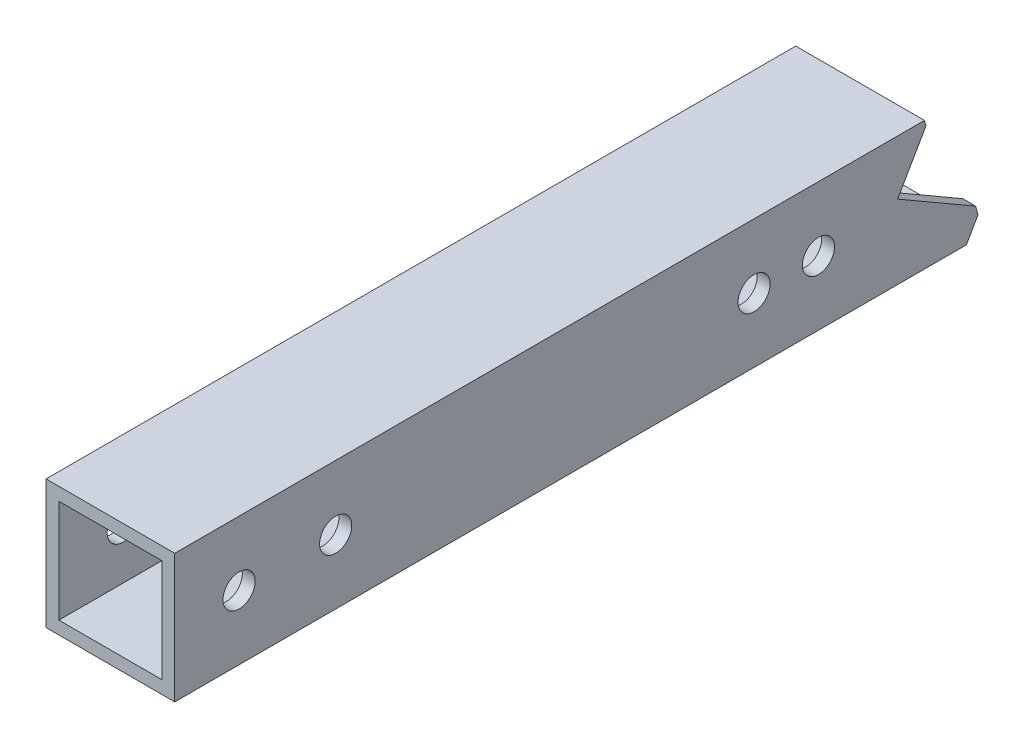
ISO-10303-21;
HEADER;
FILE_DESCRIPTION(('STEP AP214'),'2;1');
FILE_NAME('part.step','',(''),(''),'','','');
FILE_SCHEMA(('AUTOMOTIVE_DESIGN { 1 0 10303 214 1 1 1 1 }'));
ENDSEC;
DATA;
#1=APPLICATION_CONTEXT('core data for automotive mechanical design processes');
#2=APPLICATION_PROTOCOL_DEFINITION('international standard','automotive_design',2000,#1);
#3=PRODUCT_CONTEXT('',#1,'mechanical');
#4=PRODUCT('Part','Part','',(#3));
#5=PRODUCT_RELATED_PRODUCT_CATEGORY('part','',(#4));
#6=PRODUCT_DEFINITION_FORMATION('','',#4);
#7=PRODUCT_DEFINITION_CONTEXT('part definition',#1,'design');
#8=PRODUCT_DEFINITION('design','',#6,#7);
#9=PRODUCT_DEFINITION_SHAPE('','',#8);
#10=(LENGTH_UNIT() NAMED_UNIT(*) SI_UNIT(.MILLI.,.METRE.));
#11=(NAMED_UNIT(*) PLANE_ANGLE_UNIT() SI_UNIT($,.RADIAN.));
#12=(NAMED_UNIT(*) SI_UNIT($,.STERADIAN.) SOLID_ANGLE_UNIT());
#13=UNCERTAINTY_MEASURE_WITH_UNIT(LENGTH_MEASURE(1.E-05),#10,'distance_accuracy_value','');
#14=(GEOMETRIC_REPRESENTATION_CONTEXT(3) GLOBAL_UNCERTAINTY_ASSIGNED_CONTEXT((#13)) GLOBAL_UNIT_ASSIGNED_CONTEXT((#10,
#11,#12)) REPRESENTATION_CONTEXT('',''));
#15=CARTESIAN_POINT('',(0.,0.,0.));
#16=DIRECTION('',(0.,0.,1.));
#17=DIRECTION('',(1.,0.,0.));
#18=AXIS2_PLACEMENT_3D('',#15,#16,#17);
#19=CARTESIAN_POINT('',(10.,1.49899999999999,-12.3));
#20=DIRECTION('',(0.,0.86602540378444,-0.499999999999998));
#21=DIRECTION('',(0.,0.499999999999998,0.86602540378444));
#22=AXIS2_PLACEMENT_3D('',#19,#20,#21);
#23=PLANE('',#22);
#24=DIRECTION('',(0.,0.499999999999998,0.86602540378444));
#25=VECTOR('',#24,1.);
#26=CARTESIAN_POINT('',(-7.99999999999999,1.49899999999999,-12.3));
#27=LINE('',#26,#25);
#28=CARTESIAN_POINT('',(-7.99999999999999,-5.50074999999994,-24.4239226402802));
#29=VERTEX_POINT('',#28);
#30=CARTESIAN_POINT('',(-7.99999999999999,1.499,-12.3));
#31=VERTEX_POINT('',#30);
#32=EDGE_CURVE('E227',#29,#31,#27,.T.);
#33=ORIENTED_EDGE('',*,*,#32,.F.);
#34=DIRECTION('',(-1.,0.,0.));
#35=VECTOR('',#34,1.);
#36=CARTESIAN_POINT('',(-10.,-5.50074999999994,-24.4239226402802));
#37=LINE('',#36,#35);
#38=CARTESIAN_POINT('',(-10.,-5.50074999999994,-24.4239226402802));
#39=VERTEX_POINT('',#38);
#40=EDGE_CURVE('E266',#29,#39,#37,.T.);
#41=ORIENTED_EDGE('',*,*,#40,.T.);
#42=DIRECTION('',(0.,-0.499999999999998,-0.86602540378444));
#43=VECTOR('',#42,1.);
#44=CARTESIAN_POINT('',(-10.,1.49899999999999,-12.3));
#45=LINE('',#44,#43);
#46=CARTESIAN_POINT('',(-10.,1.49899999999999,-12.3));
#47=VERTEX_POINT('',#46);
#48=EDGE_CURVE('E274',#47,#39,#45,.T.);
#49=ORIENTED_EDGE('',*,*,#48,.F.);
#50=DIRECTION('',(-1.,0.,0.));
#51=VECTOR('',#50,1.);
#52=CARTESIAN_POINT('',(10.,1.49899999999999,-12.3));
#53=LINE('',#52,#51);
#54=EDGE_CURVE('E281',#31,#47,#53,.T.);
#55=ORIENTED_EDGE('',*,*,#54,.F.);
#56=EDGE_LOOP('',(#33,#41,#49,#55));
#57=FACE_BOUND('',#56,.T.);
#58=ADVANCED_FACE('F41',(#57),#23,.T.);
#59=CARTESIAN_POINT('',(0.,0.,-12.3));
#60=DIRECTION('',(0.,0.,1.));
#61=DIRECTION('',(1.,0.,0.));
#62=AXIS2_PLACEMENT_3D('',#59,#60,#61);
#63=PLANE('',#62);
#64=DIRECTION('',(0.,-1.,0.));
#65=VECTOR('',#64,1.);
#66=CARTESIAN_POINT('',(10.,-9.99999999999999,-12.3));
#67=LINE('',#66,#65);
#68=CARTESIAN_POINT('',(10.,1.49999999999999,-12.3));
#69=VERTEX_POINT('',#68);
#70=CARTESIAN_POINT('',(10.,1.49899999999999,-12.3));
#71=VERTEX_POINT('',#70);
#72=EDGE_CURVE('E444',#69,#71,#67,.T.);
#73=ORIENTED_EDGE('',*,*,#72,.T.);
#74=CARTESIAN_POINT('',(7.99999999999999,1.499,-12.3));
#75=VERTEX_POINT('',#74);
#76=EDGE_CURVE('E316',#71,#75,#53,.T.);
#77=ORIENTED_EDGE('',*,*,#76,.T.);
#78=DIRECTION('',(0.,-1.,0.));
#79=VECTOR('',#78,1.);
#80=CARTESIAN_POINT('',(8.00000000000002,-8.00000000000001,-12.3));
#81=LINE('',#80,#79);
#82=CARTESIAN_POINT('',(7.99999999999999,1.49999999999999,-12.3));
#83=VERTEX_POINT('',#82);
#84=EDGE_CURVE('E294',#83,#75,#81,.T.);
#85=ORIENTED_EDGE('',*,*,#84,.F.);
#86=DIRECTION('',(-1.,0.,0.));
#87=VECTOR('',#86,1.);
#88=CARTESIAN_POINT('',(10.,1.49999999999999,-12.3));
#89=LINE('',#88,#87);
#90=EDGE_CURVE('E295',#69,#83,#89,.T.);
#91=ORIENTED_EDGE('',*,*,#90,.F.);
#92=EDGE_LOOP('',(#73,#77,#85,#91));
#93=FACE_BOUND('',#92,.T.);
#94=ADVANCED_FACE('F374',(#93),#63,.F.);
#95=DIRECTION('',(0.,1.,0.));
#96=VECTOR('',#95,1.);
#97=CARTESIAN_POINT('',(-8.00000000000002,-8.00000000000001,-12.3));
#98=LINE('',#97,#96);
#99=CARTESIAN_POINT('',(-7.99999999999999,1.49999999999999,-12.3));
#100=VERTEX_POINT('',#99);
#101=EDGE_CURVE('E287',#31,#100,#98,.T.);
#102=ORIENTED_EDGE('',*,*,#101,.F.);
#103=ORIENTED_EDGE('',*,*,#54,.T.);
#104=DIRECTION('',(0.,1.,0.));
#105=VECTOR('',#104,1.);
#106=CARTESIAN_POINT('',(-10.,-9.99999999999999,-12.3));
#107=LINE('',#106,#105);
#108=CARTESIAN_POINT('',(-10.,1.49999999999999,-12.3));
#109=VERTEX_POINT('',#108);
#110=EDGE_CURVE('E300',#47,#109,#107,.T.);
#111=ORIENTED_EDGE('',*,*,#110,.T.);
#112=EDGE_CURVE('E210',#100,#109,#89,.T.);
#113=ORIENTED_EDGE('',*,*,#112,.F.);
#114=EDGE_LOOP('',(#102,#103,#111,#113));
#115=FACE_BOUND('',#114,.T.);
#116=ADVANCED_FACE('F299',(#115),#63,.F.);
#117=CARTESIAN_POINT('',(0.,0.,100.));
#118=DIRECTION('',(0.,0.,1.));
#119=DIRECTION('',(1.,0.,0.));
#120=AXIS2_PLACEMENT_3D('',#117,#118,#119);
#121=PLANE('',#120);
#122=DIRECTION('',(0.,1.,0.));
#123=VECTOR('',#122,1.);
#124=CARTESIAN_POINT('',(10.,9.99999999999999,100.));
#125=LINE('',#124,#123);
#126=CARTESIAN_POINT('',(10.,-10.,100.));
#127=VERTEX_POINT('',#126);
#128=CARTESIAN_POINT('',(10.,9.99999999999999,100.));
#129=VERTEX_POINT('',#128);
#130=EDGE_CURVE('E191',#127,#129,#125,.T.);
#131=ORIENTED_EDGE('',*,*,#130,.T.);
#132=DIRECTION('',(-1.,0.,0.));
#133=VECTOR('',#132,1.);
#134=CARTESIAN_POINT('',(-10.,9.99999999999999,100.));
#135=LINE('',#134,#133);
#136=CARTESIAN_POINT('',(-10.,9.99999999999999,100.));
#137=VERTEX_POINT('',#136);
#138=EDGE_CURVE('E431',#129,#137,#135,.T.);
#139=ORIENTED_EDGE('',*,*,#138,.T.);
#140=DIRECTION('',(0.,-1.,0.));
#141=VECTOR('',#140,1.);
#142=CARTESIAN_POINT('',(-10.,9.99999999999999,100.));
#143=LINE('',#142,#141);
#144=CARTESIAN_POINT('',(-10.,-10.,100.));
#145=VERTEX_POINT('',#144);
#146=EDGE_CURVE('E199',#137,#145,#143,.T.);
#147=ORIENTED_EDGE('',*,*,#146,.T.);
#148=DIRECTION('',(1.,0.,0.));
#149=VECTOR('',#148,1.);
#150=CARTESIAN_POINT('',(-10.,-10.,100.));
#151=LINE('',#150,#149);
#152=EDGE_CURVE('E193',#145,#127,#151,.T.);
#153=ORIENTED_EDGE('',*,*,#152,.T.);
#154=EDGE_LOOP('',(#131,#139,#147,#153));
#155=FACE_BOUND('',#154,.T.);
#156=DIRECTION('',(-1.,0.,0.));
#157=VECTOR('',#156,1.);
#158=CARTESIAN_POINT('',(-8.00000000000002,8.00000000000001,100.));
#159=LINE('',#158,#157);
#160=CARTESIAN_POINT('',(7.99999999999999,8.00000000000001,100.));
#161=VERTEX_POINT('',#160);
#162=CARTESIAN_POINT('',(-8.00000000000002,8.00000000000001,100.));
#163=VERTEX_POINT('',#162);
#164=EDGE_CURVE('E486',#161,#163,#159,.T.);
#165=ORIENTED_EDGE('',*,*,#164,.F.);
#166=DIRECTION('',(0.,1.,0.));
#167=VECTOR('',#166,1.);
#168=CARTESIAN_POINT('',(7.99999999999999,8.00000000000001,100.));
#169=LINE('',#168,#167);
#170=CARTESIAN_POINT('',(7.99999999999999,-8.00000000000002,100.));
#171=VERTEX_POINT('',#170);
#172=EDGE_CURVE('E483',#171,#161,#169,.T.);
#173=ORIENTED_EDGE('',*,*,#172,.F.);
#174=DIRECTION('',(1.,0.,0.));
#175=VECTOR('',#174,1.);
#176=CARTESIAN_POINT('',(-8.00000000000002,-8.00000000000002,100.));
#177=LINE('',#176,#175);
#178=CARTESIAN_POINT('',(-8.00000000000002,-8.00000000000002,100.));
#179=VERTEX_POINT('',#178);
#180=EDGE_CURVE('E423',#179,#171,#177,.T.);
#181=ORIENTED_EDGE('',*,*,#180,.F.);
#182=DIRECTION('',(0.,-1.,0.));
#183=VECTOR('',#182,1.);
#184=CARTESIAN_POINT('',(-8.00000000000002,8.00000000000001,100.));
#185=LINE('',#184,#183);
#186=EDGE_CURVE('E414',#163,#179,#185,.T.);
#187=ORIENTED_EDGE('',*,*,#186,.F.);
#188=EDGE_LOOP('',(#165,#173,#181,#187));
#189=FACE_BOUND('',#188,.T.);
#190=ADVANCED_FACE('F436',(#155,#189),#121,.T.);
#191=CARTESIAN_POINT('',(10.,9.99999999999999,100.));
#192=DIRECTION('',(-1.,0.,0.));
#193=DIRECTION('',(0.,0.,1.));
#194=AXIS2_PLACEMENT_3D('',#191,#192,#193);
#195=PLANE('',#194);
#196=CARTESIAN_POINT('',(10.,0.,0.));
#197=DIRECTION('',(-1.,0.,0.));
#198=DIRECTION('',(0.,0.,1.));
#199=AXIS2_PLACEMENT_3D('',#196,#197,#198);
#200=CIRCLE('',#199,2.5);
#201=CARTESIAN_POINT('',(10.,0.,2.49999999999999));
#202=VERTEX_POINT('',#201);
#203=EDGE_CURVE('E347',#202,#202,#200,.T.);
#204=ORIENTED_EDGE('',*,*,#203,.T.);
#205=EDGE_LOOP('',(#204));
#206=FACE_BOUND('',#205,.T.);
#207=CARTESIAN_POINT('',(10.,0.,90.));
#208=DIRECTION('',(1.,0.,0.));
#209=DIRECTION('',(0.,0.,-1.));
#210=AXIS2_PLACEMENT_3D('',#207,#208,#209);
#211=CIRCLE('',#210,2.49999999999999);
#212=CARTESIAN_POINT('',(10.,0.,87.5));
#213=VERTEX_POINT('',#212);
#214=EDGE_CURVE('E459',#213,#213,#211,.T.);
#215=ORIENTED_EDGE('',*,*,#214,.F.);
#216=EDGE_LOOP('',(#215));
#217=FACE_BOUND('',#216,.T.);
#218=CARTESIAN_POINT('',(10.,0.,75.));
#219=DIRECTION('',(1.,0.,0.));
#220=DIRECTION('',(0.,0.,-1.));
#221=AXIS2_PLACEMENT_3D('',#218,#219,#220);
#222=CIRCLE('',#221,2.5);
#223=CARTESIAN_POINT('',(10.,0.,72.5));
#224=VERTEX_POINT('',#223);
#225=EDGE_CURVE('E467',#224,#224,#222,.T.);
#226=ORIENTED_EDGE('',*,*,#225,.F.);
#227=EDGE_LOOP('',(#226));
#228=FACE_BOUND('',#227,.T.);
#229=CARTESIAN_POINT('',(10.,0.,9.99999999999999));
#230=DIRECTION('',(1.,0.,0.));
#231=DIRECTION('',(0.,0.,1.));
#232=AXIS2_PLACEMENT_3D('',#229,#230,#231);
#233=CIRCLE('',#232,2.50000000000001);
#234=CARTESIAN_POINT('',(10.,0.,12.5));
#235=VERTEX_POINT('',#234);
#236=EDGE_CURVE('E446',#235,#235,#233,.T.);
#237=ORIENTED_EDGE('',*,*,#236,.F.);
#238=EDGE_LOOP('',(#237));
#239=FACE_BOUND('',#238,.T.);
#240=DIRECTION('',(0.,0.866025403784438,-0.500000000000002));
#241=VECTOR('',#240,1.);
#242=CARTESIAN_POINT('',(10.,-6.00074999999998,-25.2899480440646));
#243=LINE('',#242,#241);
#244=CARTESIAN_POINT('',(10.,-10.,-22.980979980008));
#245=VERTEX_POINT('',#244);
#246=CARTESIAN_POINT('',(10.,-6.86677540378442,-24.7899480440646));
#247=VERTEX_POINT('',#246);
#248=EDGE_CURVE('E161',#245,#247,#243,.T.);
#249=ORIENTED_EDGE('',*,*,#248,.T.);
#250=DIRECTION('',(0.,0.965925826289069,0.25881904510252));
#251=VECTOR('',#250,1.);
#252=CARTESIAN_POINT('',(10.,-5.50074999999994,-24.4239226402802));
#253=LINE('',#252,#251);
#254=CARTESIAN_POINT('',(10.,-5.50074999999994,-24.4239226402802));
#255=VERTEX_POINT('',#254);
#256=EDGE_CURVE('E263',#247,#255,#253,.T.);
#257=ORIENTED_EDGE('',*,*,#256,.T.);
#258=DIRECTION('',(0.,-0.499999999999998,-0.86602540378444));
#259=VECTOR('',#258,1.);
#260=CARTESIAN_POINT('',(10.,1.49899999999999,-12.3));
#261=LINE('',#260,#259);
#262=EDGE_CURVE('E323',#71,#255,#261,.T.);
#263=ORIENTED_EDGE('',*,*,#262,.F.);
#264=ORIENTED_EDGE('',*,*,#72,.F.);
#265=DIRECTION('',(0.,-0.866025403784442,0.499999999999995));
#266=VECTOR('',#265,1.);
#267=CARTESIAN_POINT('',(10.,1.49999999999999,-12.3));
#268=LINE('',#267,#266);
#269=CARTESIAN_POINT('',(10.,9.13397459621555,-16.7074772881118));
#270=VERTEX_POINT('',#269);
#271=EDGE_CURVE('E308',#270,#69,#268,.T.);
#272=ORIENTED_EDGE('',*,*,#271,.F.);
#273=DIRECTION('',(0.,0.965925826289071,0.258819045102512));
#274=VECTOR('',#273,1.);
#275=CARTESIAN_POINT('',(9.99999999999999,9.99999999999999,-16.4754264805429));
#276=LINE('',#275,#274);
#277=CARTESIAN_POINT('',(10.,9.99999999999999,-16.4754264805429));
#278=VERTEX_POINT('',#277);
#279=EDGE_CURVE('E241',#270,#278,#276,.T.);
#280=ORIENTED_EDGE('',*,*,#279,.T.);
#281=DIRECTION('',(0.,0.,-1.));
#282=VECTOR('',#281,1.);
#283=CARTESIAN_POINT('',(10.,9.99999999999999,100.));
#284=LINE('',#283,#282);
#285=EDGE_CURVE('E206',#129,#278,#284,.T.);
#286=ORIENTED_EDGE('',*,*,#285,.F.);
#287=ORIENTED_EDGE('',*,*,#130,.F.);
#288=DIRECTION('',(0.,0.,-1.));
#289=VECTOR('',#288,1.);
#290=CARTESIAN_POINT('',(10.,-10.,100.));
#291=LINE('',#290,#289);
#292=EDGE_CURVE('E181',#127,#245,#291,.T.);
#293=ORIENTED_EDGE('',*,*,#292,.T.);
#294=EDGE_LOOP('',(#249,#257,#263,#264,#272,#280,#286,#287,#293));
#295=FACE_BOUND('',#294,.T.);
#296=ADVANCED_FACE('F188',(#206,#217,#228,#239,#295),#195,.F.);
#297=CARTESIAN_POINT('',(-10.,9.99999999999999,100.));
#298=DIRECTION('',(0.,-1.,0.));
#299=DIRECTION('',(0.,0.,-1.));
#300=AXIS2_PLACEMENT_3D('',#297,#298,#299);
#301=PLANE('',#300);
#302=ORIENTED_EDGE('',*,*,#285,.T.);
#303=DIRECTION('',(-1.,0.,0.));
#304=VECTOR('',#303,1.);
#305=CARTESIAN_POINT('',(-10.,9.99999999999999,-16.4754264805429));
#306=LINE('',#305,#304);
#307=CARTESIAN_POINT('',(-10.,9.99999999999999,-16.4754264805429));
#308=VERTEX_POINT('',#307);
#309=EDGE_CURVE('E244',#278,#308,#306,.T.);
#310=ORIENTED_EDGE('',*,*,#309,.T.);
#311=DIRECTION('',(0.,0.,-1.));
#312=VECTOR('',#311,1.);
#313=CARTESIAN_POINT('',(-10.,9.99999999999999,100.));
#314=LINE('',#313,#312);
#315=EDGE_CURVE('E197',#137,#308,#314,.T.);
#316=ORIENTED_EDGE('',*,*,#315,.F.);
#317=ORIENTED_EDGE('',*,*,#138,.F.);
#318=EDGE_LOOP('',(#302,#310,#316,#317));
#319=FACE_BOUND('',#318,.T.);
#320=ADVANCED_FACE('F440',(#319),#301,.F.);
#321=CARTESIAN_POINT('',(-10.,9.99999999999999,100.));
#322=DIRECTION('',(1.,0.,0.));
#323=DIRECTION('',(0.,0.,-1.));
#324=AXIS2_PLACEMENT_3D('',#321,#322,#323);
#325=PLANE('',#324);
#326=CARTESIAN_POINT('',(-10.,0.,0.));
#327=DIRECTION('',(-1.,0.,0.));
#328=DIRECTION('',(0.,0.,1.));
#329=AXIS2_PLACEMENT_3D('',#326,#327,#328);
#330=CIRCLE('',#329,2.5);
#331=CARTESIAN_POINT('',(-10.,0.,2.49999999999999));
#332=VERTEX_POINT('',#331);
#333=EDGE_CURVE('E343',#332,#332,#330,.T.);
#334=ORIENTED_EDGE('',*,*,#333,.F.);
#335=EDGE_LOOP('',(#334));
#336=FACE_BOUND('',#335,.T.);
#337=CARTESIAN_POINT('',(-10.,0.,90.));
#338=DIRECTION('',(1.,0.,0.));
#339=DIRECTION('',(0.,0.,-1.));
#340=AXIS2_PLACEMENT_3D('',#337,#338,#339);
#341=CIRCLE('',#340,2.49999999999999);
#342=CARTESIAN_POINT('',(-10.,0.,87.5));
#343=VERTEX_POINT('',#342);
#344=EDGE_CURVE('E216',#343,#343,#341,.T.);
#345=ORIENTED_EDGE('',*,*,#344,.T.);
#346=EDGE_LOOP('',(#345));
#347=FACE_BOUND('',#346,.T.);
#348=CARTESIAN_POINT('',(-10.,0.,75.));
#349=DIRECTION('',(1.,0.,0.));
#350=DIRECTION('',(0.,0.,-1.));
#351=AXIS2_PLACEMENT_3D('',#348,#349,#350);
#352=CIRCLE('',#351,2.5);
#353=CARTESIAN_POINT('',(-10.,0.,72.5));
#354=VERTEX_POINT('',#353);
#355=EDGE_CURVE('E463',#354,#354,#352,.T.);
#356=ORIENTED_EDGE('',*,*,#355,.T.);
#357=EDGE_LOOP('',(#356));
#358=FACE_BOUND('',#357,.T.);
#359=CARTESIAN_POINT('',(-10.,0.,9.99999999999999));
#360=DIRECTION('',(1.,0.,0.));
#361=DIRECTION('',(0.,0.,1.));
#362=AXIS2_PLACEMENT_3D('',#359,#360,#361);
#363=CIRCLE('',#362,2.50000000000001);
#364=CARTESIAN_POINT('',(-10.,0.,12.5));
#365=VERTEX_POINT('',#364);
#366=EDGE_CURVE('E451',#365,#365,#363,.T.);
#367=ORIENTED_EDGE('',*,*,#366,.T.);
#368=EDGE_LOOP('',(#367));
#369=FACE_BOUND('',#368,.T.);
#370=ORIENTED_EDGE('',*,*,#48,.T.);
#371=DIRECTION('',(0.,-0.965925826289069,-0.25881904510252));
#372=VECTOR('',#371,1.);
#373=CARTESIAN_POINT('',(-10.,-5.50074999999994,-24.4239226402802));
#374=LINE('',#373,#372);
#375=CARTESIAN_POINT('',(-10.,-6.86677540378442,-24.7899480440646));
#376=VERTEX_POINT('',#375);
#377=EDGE_CURVE('E52',#39,#376,#374,.T.);
#378=ORIENTED_EDGE('',*,*,#377,.T.);
#379=DIRECTION('',(0.,0.866025403784438,-0.500000000000002));
#380=VECTOR('',#379,1.);
#381=CARTESIAN_POINT('',(-10.,-6.00074999999998,-25.2899480440646));
#382=LINE('',#381,#380);
#383=CARTESIAN_POINT('',(-10.,-10.,-22.980979980008));
#384=VERTEX_POINT('',#383);
#385=EDGE_CURVE('E174',#384,#376,#382,.T.);
#386=ORIENTED_EDGE('',*,*,#385,.F.);
#387=DIRECTION('',(0.,0.,-1.));
#388=VECTOR('',#387,1.);
#389=CARTESIAN_POINT('',(-10.,-10.,100.));
#390=LINE('',#389,#388);
#391=EDGE_CURVE('E184',#145,#384,#390,.T.);
#392=ORIENTED_EDGE('',*,*,#391,.F.);
#393=ORIENTED_EDGE('',*,*,#146,.F.);
#394=ORIENTED_EDGE('',*,*,#315,.T.);
#395=DIRECTION('',(0.,-0.965925826289071,-0.258819045102512));
#396=VECTOR('',#395,1.);
#397=CARTESIAN_POINT('',(-10.,9.99999999999999,-16.4754264805429));
#398=LINE('',#397,#396);
#399=CARTESIAN_POINT('',(-10.,9.13397459621555,-16.7074772881118));
#400=VERTEX_POINT('',#399);
#401=EDGE_CURVE('E238',#308,#400,#398,.T.);
#402=ORIENTED_EDGE('',*,*,#401,.T.);
#403=DIRECTION('',(0.,-0.866025403784442,0.499999999999995));
#404=VECTOR('',#403,1.);
#405=CARTESIAN_POINT('',(-10.,1.49999999999999,-12.3));
#406=LINE('',#405,#404);
#407=EDGE_CURVE('E312',#400,#109,#406,.T.);
#408=ORIENTED_EDGE('',*,*,#407,.T.);
#409=ORIENTED_EDGE('',*,*,#110,.F.);
#410=EDGE_LOOP('',(#370,#378,#386,#392,#393,#394,#402,#408,#409));
#411=FACE_BOUND('',#410,.T.);
#412=ADVANCED_FACE('F272',(#336,#347,#358,#369,#411),#325,.F.);
#413=CARTESIAN_POINT('',(-10.,-10.,100.));
#414=DIRECTION('',(0.,1.,0.));
#415=DIRECTION('',(0.,0.,1.));
#416=AXIS2_PLACEMENT_3D('',#413,#414,#415);
#417=PLANE('',#416);
#418=ORIENTED_EDGE('',*,*,#391,.T.);
#419=DIRECTION('',(-1.,0.,0.));
#420=VECTOR('',#419,1.);
#421=CARTESIAN_POINT('',(10.,-10.,-22.980979980008));
#422=LINE('',#421,#420);
#423=EDGE_CURVE('E166',#245,#384,#422,.T.);
#424=ORIENTED_EDGE('',*,*,#423,.F.);
#425=ORIENTED_EDGE('',*,*,#292,.F.);
#426=ORIENTED_EDGE('',*,*,#152,.F.);
#427=EDGE_LOOP('',(#418,#424,#425,#426));
#428=FACE_BOUND('',#427,.T.);
#429=ADVANCED_FACE('F179',(#428),#417,.F.);
#430=CARTESIAN_POINT('',(7.99999999999999,8.00000000000001,100.));
#431=DIRECTION('',(-1.,0.,0.));
#432=DIRECTION('',(0.,0.,1.));
#433=AXIS2_PLACEMENT_3D('',#430,#431,#432);
#434=PLANE('',#433);
#435=CARTESIAN_POINT('',(7.99999999999999,0.,0.));
#436=DIRECTION('',(-1.,0.,0.));
#437=DIRECTION('',(0.,0.,1.));
#438=AXIS2_PLACEMENT_3D('',#435,#436,#437);
#439=CIRCLE('',#438,2.5);
#440=CARTESIAN_POINT('',(7.99999999999999,0.,2.49999999999999));
#441=VERTEX_POINT('',#440);
#442=EDGE_CURVE('E276',#441,#441,#439,.T.);
#443=ORIENTED_EDGE('',*,*,#442,.F.);
#444=EDGE_LOOP('',(#443));
#445=FACE_BOUND('',#444,.T.);
#446=DIRECTION('',(0.,-0.499999999999998,-0.86602540378444));
#447=VECTOR('',#446,1.);
#448=CARTESIAN_POINT('',(7.99999999999999,1.49899999999999,-12.3));
#449=LINE('',#448,#447);
#450=CARTESIAN_POINT('',(7.99999999999999,-5.50074999999994,-24.4239226402802));
#451=VERTEX_POINT('',#450);
#452=EDGE_CURVE('E230',#75,#451,#449,.T.);
#453=ORIENTED_EDGE('',*,*,#452,.T.);
#454=DIRECTION('',(0.,-0.965925826289069,-0.25881904510252));
#455=VECTOR('',#454,1.);
#456=CARTESIAN_POINT('',(7.99999999999999,38.2016018951413,-12.7139127426364));
#457=LINE('',#456,#455);
#458=CARTESIAN_POINT('',(7.99999999999999,-6.86677540378444,-24.7899480440646));
#459=VERTEX_POINT('',#458);
#460=EDGE_CURVE('E255',#451,#459,#457,.T.);
#461=ORIENTED_EDGE('',*,*,#460,.T.);
#462=DIRECTION('',(0.,0.866025403784438,-0.500000000000002));
#463=VECTOR('',#462,1.);
#464=CARTESIAN_POINT('',(7.99999999999999,-49.7523264224964,-0.0299636190657787));
#465=LINE('',#464,#463);
#466=CARTESIAN_POINT('',(7.99999999999999,-8.00000000000002,-24.1356805183873));
#467=VERTEX_POINT('',#466);
#468=EDGE_CURVE('E332',#467,#459,#465,.T.);
#469=ORIENTED_EDGE('',*,*,#468,.F.);
#470=DIRECTION('',(0.,0.,-1.));
#471=VECTOR('',#470,1.);
#472=CARTESIAN_POINT('',(7.99999999999999,-8.00000000000002,100.));
#473=LINE('',#472,#471);
#474=EDGE_CURVE('E412',#171,#467,#473,.T.);
#475=ORIENTED_EDGE('',*,*,#474,.F.);
#476=ORIENTED_EDGE('',*,*,#172,.T.);
#477=DIRECTION('',(0.,0.,-1.));
#478=VECTOR('',#477,1.);
#479=CARTESIAN_POINT('',(7.99999999999999,8.00000000000001,100.));
#480=LINE('',#479,#478);
#481=CARTESIAN_POINT('',(7.99999999999999,8.00000000000001,-16.0527767497325));
#482=VERTEX_POINT('',#481);
#483=EDGE_CURVE('E421',#161,#482,#480,.T.);
#484=ORIENTED_EDGE('',*,*,#483,.T.);
#485=DIRECTION('',(0.,-0.866025403784442,0.499999999999995));
#486=VECTOR('',#485,1.);
#487=CARTESIAN_POINT('',(7.99999999999999,1.49999999999999,-12.3));
#488=LINE('',#487,#486);
#489=EDGE_CURVE('E324',#482,#83,#488,.T.);
#490=ORIENTED_EDGE('',*,*,#489,.T.);
#491=ORIENTED_EDGE('',*,*,#84,.T.);
#492=EDGE_LOOP('',(#453,#461,#469,#475,#476,#484,#490,#491));
#493=FACE_BOUND('',#492,.T.);
#494=CARTESIAN_POINT('',(7.99999999999999,0.,90.));
#495=DIRECTION('',(-1.,0.,0.));
#496=DIRECTION('',(0.,0.,1.));
#497=AXIS2_PLACEMENT_3D('',#494,#495,#496);
#498=CIRCLE('',#497,2.49999999999999);
#499=CARTESIAN_POINT('',(7.99999999999999,0.,92.5));
#500=VERTEX_POINT('',#499);
#501=EDGE_CURVE('E226',#500,#500,#498,.T.);
#502=ORIENTED_EDGE('',*,*,#501,.F.);
#503=EDGE_LOOP('',(#502));
#504=FACE_BOUND('',#503,.T.);
#505=CARTESIAN_POINT('',(7.99999999999999,0.,75.));
#506=DIRECTION('',(-1.,0.,0.));
#507=DIRECTION('',(0.,0.,1.));
#508=AXIS2_PLACEMENT_3D('',#505,#506,#507);
#509=CIRCLE('',#508,2.5);
#510=CARTESIAN_POINT('',(7.99999999999999,0.,77.5));
#511=VERTEX_POINT('',#510);
#512=EDGE_CURVE('E221',#511,#511,#509,.T.);
#513=ORIENTED_EDGE('',*,*,#512,.F.);
#514=EDGE_LOOP('',(#513));
#515=FACE_BOUND('',#514,.T.);
#516=CARTESIAN_POINT('',(7.99999999999999,0.,9.99999999999999));
#517=DIRECTION('',(-1.,0.,0.));
#518=DIRECTION('',(0.,0.,1.));
#519=AXIS2_PLACEMENT_3D('',#516,#517,#518);
#520=CIRCLE('',#519,2.50000000000001);
#521=CARTESIAN_POINT('',(7.99999999999999,0.,12.5));
#522=VERTEX_POINT('',#521);
#523=EDGE_CURVE('E215',#522,#522,#520,.T.);
#524=ORIENTED_EDGE('',*,*,#523,.F.);
#525=EDGE_LOOP('',(#524));
#526=FACE_BOUND('',#525,.T.);
#527=ADVANCED_FACE('F370',(#445,#493,#504,#515,#526),#434,.T.);
#528=CARTESIAN_POINT('',(-8.00000000000002,8.00000000000001,100.));
#529=DIRECTION('',(0.,-1.,0.));
#530=DIRECTION('',(0.,0.,-1.));
#531=AXIS2_PLACEMENT_3D('',#528,#529,#530);
#532=PLANE('',#531);
#533=DIRECTION('',(0.,0.,-1.));
#534=VECTOR('',#533,1.);
#535=CARTESIAN_POINT('',(-8.00000000000002,8.00000000000001,100.));
#536=LINE('',#535,#534);
#537=CARTESIAN_POINT('',(-7.99999999999999,8.00000000000001,-16.0527767497325));
#538=VERTEX_POINT('',#537);
#539=EDGE_CURVE('E417',#163,#538,#536,.T.);
#540=ORIENTED_EDGE('',*,*,#539,.T.);
#541=DIRECTION('',(1.,0.,0.));
#542=VECTOR('',#541,1.);
#543=CARTESIAN_POINT('',(10.,8.00000000000001,-16.0527767497325));
#544=LINE('',#543,#542);
#545=EDGE_CURVE('E234',#538,#482,#544,.T.);
#546=ORIENTED_EDGE('',*,*,#545,.T.);
#547=ORIENTED_EDGE('',*,*,#483,.F.);
#548=ORIENTED_EDGE('',*,*,#164,.T.);
#549=EDGE_LOOP('',(#540,#546,#547,#548));
#550=FACE_BOUND('',#549,.T.);
#551=ADVANCED_FACE('F361',(#550),#532,.T.);
#552=CARTESIAN_POINT('',(-8.00000000000002,8.00000000000001,100.));
#553=DIRECTION('',(1.,0.,0.));
#554=DIRECTION('',(0.,0.,-1.));
#555=AXIS2_PLACEMENT_3D('',#552,#553,#554);
#556=PLANE('',#555);
#557=CARTESIAN_POINT('',(-8.00000000000002,0.,0.));
#558=DIRECTION('',(1.,0.,0.));
#559=DIRECTION('',(0.,0.,-1.));
#560=AXIS2_PLACEMENT_3D('',#557,#558,#559);
#561=CIRCLE('',#560,2.5);
#562=CARTESIAN_POINT('',(-8.00000000000002,0.,-2.50000000000001));
#563=VERTEX_POINT('',#562);
#564=EDGE_CURVE('E46',#563,#563,#561,.T.);
#565=ORIENTED_EDGE('',*,*,#564,.F.);
#566=EDGE_LOOP('',(#565));
#567=FACE_BOUND('',#566,.T.);
#568=DIRECTION('',(0.,-0.866025403784438,0.500000000000002));
#569=VECTOR('',#568,1.);
#570=CARTESIAN_POINT('',(-8.00000000000002,-49.7523264224964,-0.0299636190657787));
#571=LINE('',#570,#569);
#572=CARTESIAN_POINT('',(-8.00000000000002,-6.86677540378444,-24.7899480440646));
#573=VERTEX_POINT('',#572);
#574=CARTESIAN_POINT('',(-8.00000000000002,-8.00000000000002,-24.1356805183873));
#575=VERTEX_POINT('',#574);
#576=EDGE_CURVE('E335',#573,#575,#571,.T.);
#577=ORIENTED_EDGE('',*,*,#576,.F.);
#578=DIRECTION('',(0.,0.965925826289069,0.25881904510252));
#579=VECTOR('',#578,1.);
#580=CARTESIAN_POINT('',(-8.00000000000002,38.2016018951413,-12.7139127426364));
#581=LINE('',#580,#579);
#582=EDGE_CURVE('E11',#573,#29,#581,.T.);
#583=ORIENTED_EDGE('',*,*,#582,.T.);
#584=ORIENTED_EDGE('',*,*,#32,.T.);
#585=ORIENTED_EDGE('',*,*,#101,.T.);
#586=DIRECTION('',(0.,0.866025403784442,-0.499999999999995));
#587=VECTOR('',#586,1.);
#588=CARTESIAN_POINT('',(-7.99999999999999,1.49999999999999,-12.3));
#589=LINE('',#588,#587);
#590=EDGE_CURVE('E290',#100,#538,#589,.T.);
#591=ORIENTED_EDGE('',*,*,#590,.T.);
#592=ORIENTED_EDGE('',*,*,#539,.F.);
#593=ORIENTED_EDGE('',*,*,#186,.T.);
#594=DIRECTION('',(0.,0.,-1.));
#595=VECTOR('',#594,1.);
#596=CARTESIAN_POINT('',(-8.00000000000002,-8.00000000000002,100.));
#597=LINE('',#596,#595);
#598=EDGE_CURVE('E410',#179,#575,#597,.T.);
#599=ORIENTED_EDGE('',*,*,#598,.T.);
#600=EDGE_LOOP('',(#577,#583,#584,#585,#591,#592,#593,#599));
#601=FACE_BOUND('',#600,.T.);
#602=CARTESIAN_POINT('',(-8.00000000000002,0.,90.));
#603=DIRECTION('',(1.,0.,0.));
#604=DIRECTION('',(0.,0.,-1.));
#605=AXIS2_PLACEMENT_3D('',#602,#603,#604);
#606=CIRCLE('',#605,2.49999999999999);
#607=CARTESIAN_POINT('',(-8.00000000000002,0.,87.5));
#608=VERTEX_POINT('',#607);
#609=EDGE_CURVE('E222',#608,#608,#606,.T.);
#610=ORIENTED_EDGE('',*,*,#609,.F.);
#611=EDGE_LOOP('',(#610));
#612=FACE_BOUND('',#611,.T.);
#613=CARTESIAN_POINT('',(-8.00000000000002,0.,75.));
#614=DIRECTION('',(1.,0.,0.));
#615=DIRECTION('',(0.,0.,-1.));
#616=AXIS2_PLACEMENT_3D('',#613,#614,#615);
#617=CIRCLE('',#616,2.5);
#618=CARTESIAN_POINT('',(-8.00000000000002,0.,72.5));
#619=VERTEX_POINT('',#618);
#620=EDGE_CURVE('E217',#619,#619,#617,.T.);
#621=ORIENTED_EDGE('',*,*,#620,.F.);
#622=EDGE_LOOP('',(#621));
#623=FACE_BOUND('',#622,.T.);
#624=CARTESIAN_POINT('',(-8.00000000000002,0.,9.99999999999999));
#625=DIRECTION('',(1.,0.,0.));
#626=DIRECTION('',(0.,0.,-1.));
#627=AXIS2_PLACEMENT_3D('',#624,#625,#626);
#628=CIRCLE('',#627,2.50000000000001);
#629=CARTESIAN_POINT('',(-8.00000000000002,0.,7.49999999999999));
#630=VERTEX_POINT('',#629);
#631=EDGE_CURVE('E211',#630,#630,#628,.T.);
#632=ORIENTED_EDGE('',*,*,#631,.F.);
#633=EDGE_LOOP('',(#632));
#634=FACE_BOUND('',#633,.T.);
#635=ADVANCED_FACE('F284',(#567,#601,#612,#623,#634),#556,.T.);
#636=CARTESIAN_POINT('',(-8.00000000000002,-8.00000000000002,100.));
#637=DIRECTION('',(0.,1.,0.));
#638=DIRECTION('',(0.,0.,1.));
#639=AXIS2_PLACEMENT_3D('',#636,#637,#638);
#640=PLANE('',#639);
#641=DIRECTION('',(1.,0.,0.));
#642=VECTOR('',#641,1.);
#643=CARTESIAN_POINT('',(-8.00000000000002,-8.00000000000002,-24.1356805183873));
#644=LINE('',#643,#642);
#645=EDGE_CURVE('E186',#575,#467,#644,.T.);
#646=ORIENTED_EDGE('',*,*,#645,.F.);
#647=ORIENTED_EDGE('',*,*,#598,.F.);
#648=ORIENTED_EDGE('',*,*,#180,.T.);
#649=ORIENTED_EDGE('',*,*,#474,.T.);
#650=EDGE_LOOP('',(#646,#647,#648,#649));
#651=FACE_BOUND('',#650,.T.);
#652=ADVANCED_FACE('F360',(#651),#640,.T.);
#653=CARTESIAN_POINT('',(-10.,0.,9.99999999999999));
#654=DIRECTION('',(1.,0.,0.));
#655=DIRECTION('',(0.,0.,-1.));
#656=AXIS2_PLACEMENT_3D('',#653,#654,#655);
#657=CYLINDRICAL_SURFACE('',#656,2.50000000000001);
#658=ORIENTED_EDGE('',*,*,#631,.T.);
#659=EDGE_LOOP('',(#658));
#660=FACE_BOUND('',#659,.T.);
#661=ORIENTED_EDGE('',*,*,#366,.F.);
#662=EDGE_LOOP('',(#661));
#663=FACE_BOUND('',#662,.T.);
#664=ADVANCED_FACE('F367',(#660,#663),#657,.F.);
#665=CARTESIAN_POINT('',(-10.,0.,75.));
#666=DIRECTION('',(1.,0.,0.));
#667=DIRECTION('',(0.,0.,-1.));
#668=AXIS2_PLACEMENT_3D('',#665,#666,#667);
#669=CYLINDRICAL_SURFACE('',#668,2.5);
#670=ORIENTED_EDGE('',*,*,#620,.T.);
#671=EDGE_LOOP('',(#670));
#672=FACE_BOUND('',#671,.T.);
#673=ORIENTED_EDGE('',*,*,#355,.F.);
#674=EDGE_LOOP('',(#673));
#675=FACE_BOUND('',#674,.T.);
#676=ADVANCED_FACE('F700',(#672,#675),#669,.F.);
#677=CARTESIAN_POINT('',(-10.,0.,90.));
#678=DIRECTION('',(1.,0.,0.));
#679=DIRECTION('',(0.,0.,-1.));
#680=AXIS2_PLACEMENT_3D('',#677,#678,#679);
#681=CYLINDRICAL_SURFACE('',#680,2.49999999999999);
#682=ORIENTED_EDGE('',*,*,#609,.T.);
#683=EDGE_LOOP('',(#682));
#684=FACE_BOUND('',#683,.T.);
#685=ORIENTED_EDGE('',*,*,#344,.F.);
#686=EDGE_LOOP('',(#685));
#687=FACE_BOUND('',#686,.T.);
#688=ADVANCED_FACE('F690',(#684,#687),#681,.F.);
#689=ORIENTED_EDGE('',*,*,#523,.T.);
#690=EDGE_LOOP('',(#689));
#691=FACE_BOUND('',#690,.T.);
#692=ORIENTED_EDGE('',*,*,#236,.T.);
#693=EDGE_LOOP('',(#692));
#694=FACE_BOUND('',#693,.T.);
#695=ADVANCED_FACE('F697',(#691,#694),#657,.F.);
#696=ORIENTED_EDGE('',*,*,#512,.T.);
#697=EDGE_LOOP('',(#696));
#698=FACE_BOUND('',#697,.T.);
#699=ORIENTED_EDGE('',*,*,#225,.T.);
#700=EDGE_LOOP('',(#699));
#701=FACE_BOUND('',#700,.T.);
#702=ADVANCED_FACE('F687',(#698,#701),#669,.F.);
#703=ORIENTED_EDGE('',*,*,#501,.T.);
#704=EDGE_LOOP('',(#703));
#705=FACE_BOUND('',#704,.T.);
#706=ORIENTED_EDGE('',*,*,#214,.T.);
#707=EDGE_LOOP('',(#706));
#708=FACE_BOUND('',#707,.T.);
#709=ADVANCED_FACE('F395',(#705,#708),#681,.F.);
#710=CARTESIAN_POINT('',(10.,1.49999999999999,-12.3));
#711=DIRECTION('',(0.,-0.499999999999995,-0.866025403784442));
#712=DIRECTION('',(0.,0.866025403784442,-0.499999999999995));
#713=AXIS2_PLACEMENT_3D('',#710,#711,#712);
#714=PLANE('',#713);
#715=ORIENTED_EDGE('',*,*,#407,.F.);
#716=DIRECTION('',(1.,0.,0.));
#717=VECTOR('',#716,1.);
#718=CARTESIAN_POINT('',(10.,9.13397459621555,-16.7074772881118));
#719=LINE('',#718,#717);
#720=EDGE_CURVE('E248',#400,#270,#719,.T.);
#721=ORIENTED_EDGE('',*,*,#720,.T.);
#722=ORIENTED_EDGE('',*,*,#271,.T.);
#723=ORIENTED_EDGE('',*,*,#90,.T.);
#724=ORIENTED_EDGE('',*,*,#489,.F.);
#725=ORIENTED_EDGE('',*,*,#545,.F.);
#726=ORIENTED_EDGE('',*,*,#590,.F.);
#727=ORIENTED_EDGE('',*,*,#112,.T.);
#728=EDGE_LOOP('',(#715,#721,#722,#723,#724,#725,#726,#727));
#729=FACE_BOUND('',#728,.T.);
#730=ADVANCED_FACE('F387',(#729),#714,.T.);
#731=ORIENTED_EDGE('',*,*,#262,.T.);
#732=DIRECTION('',(-1.,0.,0.));
#733=VECTOR('',#732,1.);
#734=CARTESIAN_POINT('',(7.99999999999999,-5.50074999999994,-24.4239226402802));
#735=LINE('',#734,#733);
#736=EDGE_CURVE('E251',#255,#451,#735,.T.);
#737=ORIENTED_EDGE('',*,*,#736,.T.);
#738=ORIENTED_EDGE('',*,*,#452,.F.);
#739=ORIENTED_EDGE('',*,*,#76,.F.);
#740=EDGE_LOOP('',(#731,#737,#738,#739));
#741=FACE_BOUND('',#740,.T.);
#742=ADVANCED_FACE('F376',(#741),#23,.T.);
#743=CARTESIAN_POINT('',(-10.,9.99999999999999,-16.4754264805429));
#744=DIRECTION('',(0.,0.258819045102512,-0.965925826289071));
#745=DIRECTION('',(1.,0.,0.));
#746=AXIS2_PLACEMENT_3D('',#743,#744,#745);
#747=PLANE('',#746);
#748=ORIENTED_EDGE('',*,*,#279,.F.);
#749=ORIENTED_EDGE('',*,*,#720,.F.);
#750=ORIENTED_EDGE('',*,*,#401,.F.);
#751=ORIENTED_EDGE('',*,*,#309,.F.);
#752=EDGE_LOOP('',(#748,#749,#750,#751));
#753=FACE_BOUND('',#752,.T.);
#754=ADVANCED_FACE('F386',(#753),#747,.T.);
#755=CARTESIAN_POINT('',(10.,-6.00074999999998,-25.2899480440646));
#756=DIRECTION('',(0.,0.500000000000002,0.866025403784438));
#757=DIRECTION('',(0.,-0.866025403784438,0.500000000000002));
#758=AXIS2_PLACEMENT_3D('',#755,#756,#757);
#759=PLANE('',#758);
#760=ORIENTED_EDGE('',*,*,#468,.T.);
#761=DIRECTION('',(1.,0.,0.));
#762=VECTOR('',#761,1.);
#763=CARTESIAN_POINT('',(10.,-6.86677540378442,-24.7899480440646));
#764=LINE('',#763,#762);
#765=EDGE_CURVE('E169',#459,#247,#764,.T.);
#766=ORIENTED_EDGE('',*,*,#765,.T.);
#767=ORIENTED_EDGE('',*,*,#248,.F.);
#768=ORIENTED_EDGE('',*,*,#423,.T.);
#769=ORIENTED_EDGE('',*,*,#385,.T.);
#770=DIRECTION('',(1.,0.,0.));
#771=VECTOR('',#770,1.);
#772=CARTESIAN_POINT('',(-8.00000000000001,-6.86677540378442,-24.7899480440646));
#773=LINE('',#772,#771);
#774=EDGE_CURVE('E258',#376,#573,#773,.T.);
#775=ORIENTED_EDGE('',*,*,#774,.T.);
#776=ORIENTED_EDGE('',*,*,#576,.T.);
#777=ORIENTED_EDGE('',*,*,#645,.T.);
#778=EDGE_LOOP('',(#760,#766,#767,#768,#769,#775,#776,#777));
#779=FACE_BOUND('',#778,.T.);
#780=ADVANCED_FACE('F164',(#779),#759,.F.);
#781=CARTESIAN_POINT('',(10.,-5.50074999999994,-24.4239226402802));
#782=DIRECTION('',(0.,0.25881904510252,-0.965925826289069));
#783=DIRECTION('',(1.,0.,0.));
#784=AXIS2_PLACEMENT_3D('',#781,#782,#783);
#785=PLANE('',#784);
#786=ORIENTED_EDGE('',*,*,#256,.F.);
#787=ORIENTED_EDGE('',*,*,#765,.F.);
#788=ORIENTED_EDGE('',*,*,#460,.F.);
#789=ORIENTED_EDGE('',*,*,#736,.F.);
#790=EDGE_LOOP('',(#786,#787,#788,#789));
#791=FACE_BOUND('',#790,.T.);
#792=ADVANCED_FACE('F401',(#791),#785,.T.);
#793=CARTESIAN_POINT('',(10.,-5.50074999999994,-24.4239226402802));
#794=DIRECTION('',(0.,0.25881904510252,-0.965925826289069));
#795=DIRECTION('',(1.,0.,0.));
#796=AXIS2_PLACEMENT_3D('',#793,#794,#795);
#797=PLANE('',#796);
#798=ORIENTED_EDGE('',*,*,#582,.F.);
#799=ORIENTED_EDGE('',*,*,#774,.F.);
#800=ORIENTED_EDGE('',*,*,#377,.F.);
#801=ORIENTED_EDGE('',*,*,#40,.F.);
#802=EDGE_LOOP('',(#798,#799,#800,#801));
#803=FACE_BOUND('',#802,.T.);
#804=ADVANCED_FACE('F44',(#803),#797,.T.);
#805=CARTESIAN_POINT('',(10.,0.,0.));
#806=DIRECTION('',(-1.,0.,0.));
#807=DIRECTION('',(0.,0.,1.));
#808=AXIS2_PLACEMENT_3D('',#805,#806,#807);
#809=CYLINDRICAL_SURFACE('',#808,2.5);
#810=ORIENTED_EDGE('',*,*,#564,.T.);
#811=EDGE_LOOP('',(#810));
#812=FACE_BOUND('',#811,.T.);
#813=ORIENTED_EDGE('',*,*,#333,.T.);
#814=EDGE_LOOP('',(#813));
#815=FACE_BOUND('',#814,.T.);
#816=ADVANCED_FACE('F356',(#812,#815),#809,.F.);
#817=ORIENTED_EDGE('',*,*,#442,.T.);
#818=EDGE_LOOP('',(#817));
#819=FACE_BOUND('',#818,.T.);
#820=ORIENTED_EDGE('',*,*,#203,.F.);
#821=EDGE_LOOP('',(#820));
#822=FACE_BOUND('',#821,.T.);
#823=ADVANCED_FACE('F527',(#819,#822),#809,.F.);
#824=CLOSED_SHELL('',(#58,#94,#116,#190,#296,#320,#412,#429,#527,#551,#635,#652,#664,#676,#688,
#695,#702,#709,#730,#742,#754,#780,#792,#804,#816,#823));
#825=MANIFOLD_SOLID_BREP('B2',#824);
#826=ADVANCED_BREP_SHAPE_REPRESENTATION('',(#18,#825),#14);
#827=SHAPE_DEFINITION_REPRESENTATION(#9,#826);
ENDSEC;
END-ISO-10303-21;
